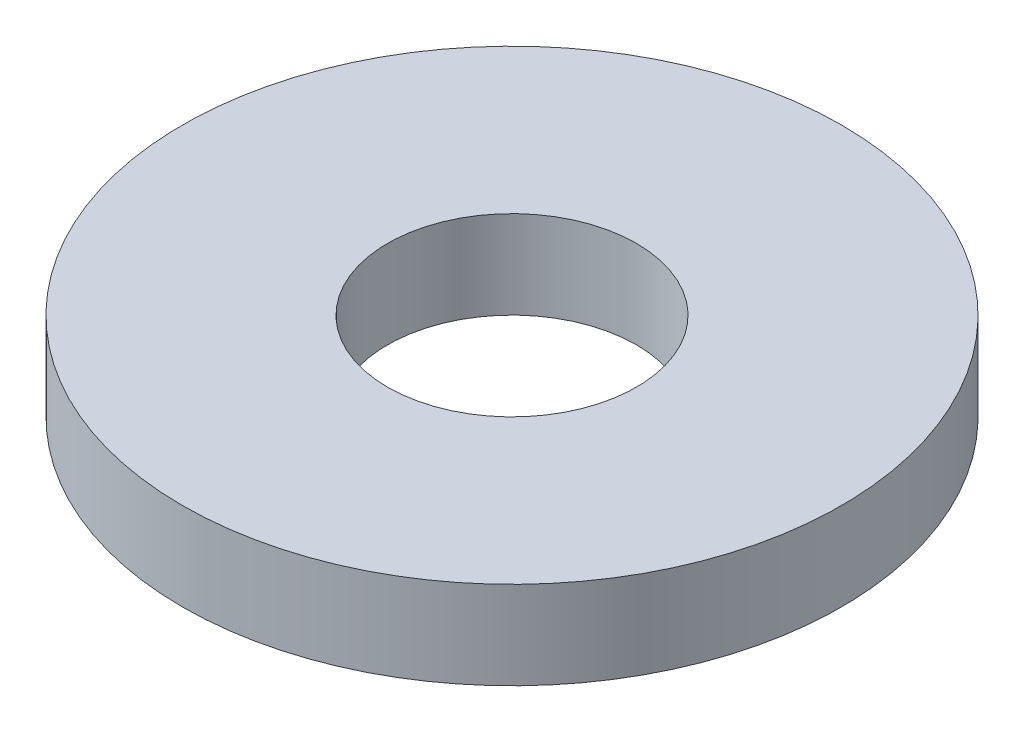
ISO-10303-21;
HEADER;
FILE_DESCRIPTION(('STEP AP214'),'2;1');
FILE_NAME('part.step','',(''),(''),'','','');
FILE_SCHEMA(('AUTOMOTIVE_DESIGN { 1 0 10303 214 1 1 1 1 }'));
ENDSEC;
DATA;
#1=APPLICATION_CONTEXT('core data for automotive mechanical design processes');
#2=APPLICATION_PROTOCOL_DEFINITION('international standard','automotive_design',2000,#1);
#3=PRODUCT_CONTEXT('',#1,'mechanical');
#4=PRODUCT('Part','Part','',(#3));
#5=PRODUCT_RELATED_PRODUCT_CATEGORY('part','',(#4));
#6=PRODUCT_DEFINITION_FORMATION('','',#4);
#7=PRODUCT_DEFINITION_CONTEXT('part definition',#1,'design');
#8=PRODUCT_DEFINITION('design','',#6,#7);
#9=PRODUCT_DEFINITION_SHAPE('','',#8);
#10=(LENGTH_UNIT() NAMED_UNIT(*) SI_UNIT(.MILLI.,.METRE.));
#11=(NAMED_UNIT(*) PLANE_ANGLE_UNIT() SI_UNIT($,.RADIAN.));
#12=(NAMED_UNIT(*) SI_UNIT($,.STERADIAN.) SOLID_ANGLE_UNIT());
#13=UNCERTAINTY_MEASURE_WITH_UNIT(LENGTH_MEASURE(1.E-05),#10,'distance_accuracy_value','');
#14=(GEOMETRIC_REPRESENTATION_CONTEXT(3) GLOBAL_UNCERTAINTY_ASSIGNED_CONTEXT((#13)) GLOBAL_UNIT_ASSIGNED_CONTEXT((#10,
#11,#12)) REPRESENTATION_CONTEXT('',''));
#15=CARTESIAN_POINT('',(0.,0.,0.));
#16=DIRECTION('',(0.,0.,1.));
#17=DIRECTION('',(1.,0.,0.));
#18=AXIS2_PLACEMENT_3D('',#15,#16,#17);
#19=CARTESIAN_POINT('',(0.,6.,0.));
#20=DIRECTION('',(0.,1.,0.));
#21=DIRECTION('',(0.,0.,1.));
#22=AXIS2_PLACEMENT_3D('',#19,#20,#21);
#23=PLANE('',#22);
#24=CARTESIAN_POINT('',(0.,6.,0.));
#25=DIRECTION('',(0.,1.,0.));
#26=DIRECTION('',(0.,0.,1.));
#27=AXIS2_PLACEMENT_3D('',#24,#25,#26);
#28=CIRCLE('',#27,22.5);
#29=CARTESIAN_POINT('',(0.,6.,22.5));
#30=VERTEX_POINT('',#29);
#31=EDGE_CURVE('E10',#30,#30,#28,.T.);
#32=ORIENTED_EDGE('',*,*,#31,.T.);
#33=EDGE_LOOP('',(#32));
#34=FACE_BOUND('',#33,.T.);
#35=CARTESIAN_POINT('',(0.,6.,0.));
#36=DIRECTION('',(0.,1.,0.));
#37=DIRECTION('',(0.,0.,1.));
#38=AXIS2_PLACEMENT_3D('',#35,#36,#37);
#39=CIRCLE('',#38,8.5);
#40=CARTESIAN_POINT('',(0.,6.,8.5));
#41=VERTEX_POINT('',#40);
#42=EDGE_CURVE('E54',#41,#41,#39,.T.);
#43=ORIENTED_EDGE('',*,*,#42,.F.);
#44=EDGE_LOOP('',(#43));
#45=FACE_BOUND('',#44,.T.);
#46=ADVANCED_FACE('F41',(#34,#45),#23,.T.);
#47=CARTESIAN_POINT('',(0.,0.,0.));
#48=DIRECTION('',(0.,1.,0.));
#49=DIRECTION('',(0.,0.,1.));
#50=AXIS2_PLACEMENT_3D('',#47,#48,#49);
#51=PLANE('',#50);
#52=CARTESIAN_POINT('',(0.,0.,0.));
#53=DIRECTION('',(0.,1.,0.));
#54=DIRECTION('',(0.,0.,1.));
#55=AXIS2_PLACEMENT_3D('',#52,#53,#54);
#56=CIRCLE('',#55,22.5);
#57=CARTESIAN_POINT('',(0.,0.,22.5));
#58=VERTEX_POINT('',#57);
#59=EDGE_CURVE('E45',#58,#58,#56,.T.);
#60=ORIENTED_EDGE('',*,*,#59,.F.);
#61=EDGE_LOOP('',(#60));
#62=FACE_BOUND('',#61,.T.);
#63=CARTESIAN_POINT('',(0.,0.,0.));
#64=DIRECTION('',(0.,1.,0.));
#65=DIRECTION('',(0.,0.,1.));
#66=AXIS2_PLACEMENT_3D('',#63,#64,#65);
#67=CIRCLE('',#66,8.5);
#68=CARTESIAN_POINT('',(0.,0.,8.5));
#69=VERTEX_POINT('',#68);
#70=EDGE_CURVE('E56',#69,#69,#67,.T.);
#71=ORIENTED_EDGE('',*,*,#70,.T.);
#72=EDGE_LOOP('',(#71));
#73=FACE_BOUND('',#72,.T.);
#74=ADVANCED_FACE('F68',(#62,#73),#51,.F.);
#75=CARTESIAN_POINT('',(0.,6.,0.));
#76=DIRECTION('',(0.,-1.,0.));
#77=DIRECTION('',(0.,0.,-1.));
#78=AXIS2_PLACEMENT_3D('',#75,#76,#77);
#79=CYLINDRICAL_SURFACE('',#78,22.5);
#80=ORIENTED_EDGE('',*,*,#31,.F.);
#81=EDGE_LOOP('',(#80));
#82=FACE_BOUND('',#81,.T.);
#83=ORIENTED_EDGE('',*,*,#59,.T.);
#84=EDGE_LOOP('',(#83));
#85=FACE_BOUND('',#84,.T.);
#86=ADVANCED_FACE('F43',(#82,#85),#79,.T.);
#87=CARTESIAN_POINT('',(0.,6.,0.));
#88=DIRECTION('',(0.,-1.,0.));
#89=DIRECTION('',(0.,0.,-1.));
#90=AXIS2_PLACEMENT_3D('',#87,#88,#89);
#91=CYLINDRICAL_SURFACE('',#90,8.5);
#92=ORIENTED_EDGE('',*,*,#42,.T.);
#93=EDGE_LOOP('',(#92));
#94=FACE_BOUND('',#93,.T.);
#95=ORIENTED_EDGE('',*,*,#70,.F.);
#96=EDGE_LOOP('',(#95));
#97=FACE_BOUND('',#96,.T.);
#98=ADVANCED_FACE('F64',(#94,#97),#91,.F.);
#99=CLOSED_SHELL('',(#46,#74,#86,#98));
#100=MANIFOLD_SOLID_BREP('B2',#99);
#101=ADVANCED_BREP_SHAPE_REPRESENTATION('',(#18,#100),#14);
#102=SHAPE_DEFINITION_REPRESENTATION(#9,#101);
ENDSEC;
END-ISO-10303-21;
